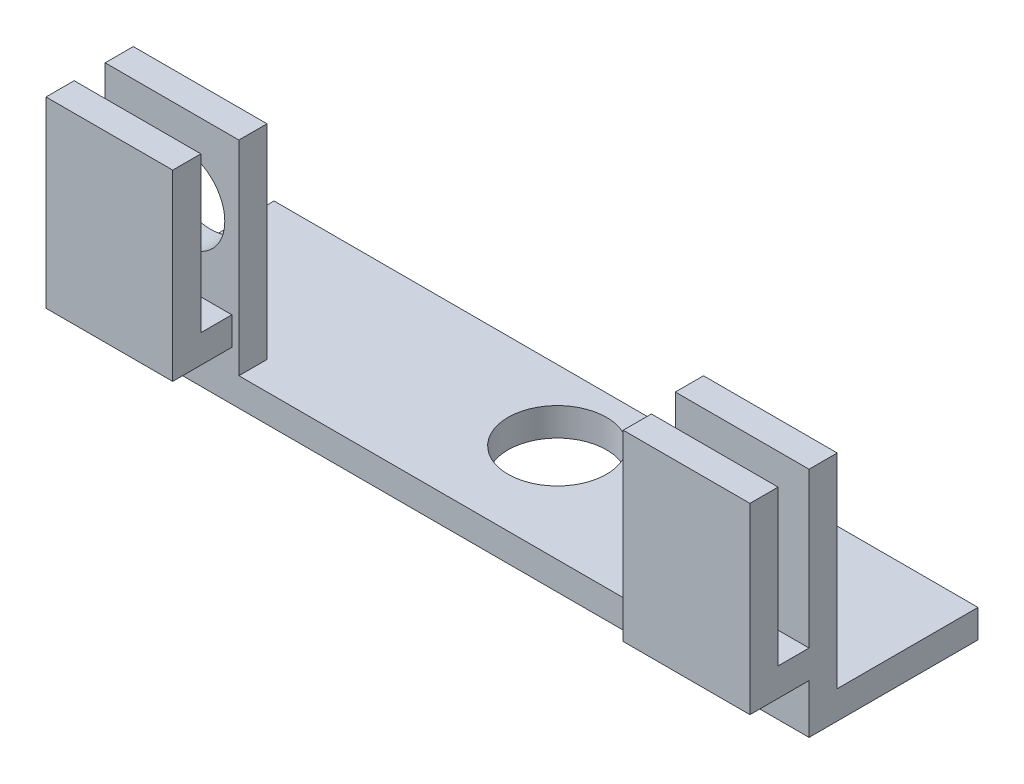
ISO-10303-21;
HEADER;
FILE_DESCRIPTION(('STEP AP214'),'2;1');
FILE_NAME('part.step','',(''),(''),'','','');
FILE_SCHEMA(('AUTOMOTIVE_DESIGN { 1 0 10303 214 1 1 1 1 }'));
ENDSEC;
DATA;
#1=APPLICATION_CONTEXT('core data for automotive mechanical design processes');
#2=APPLICATION_PROTOCOL_DEFINITION('international standard','automotive_design',2000,#1);
#3=PRODUCT_CONTEXT('',#1,'mechanical');
#4=PRODUCT('Part','Part','',(#3));
#5=PRODUCT_RELATED_PRODUCT_CATEGORY('part','',(#4));
#6=PRODUCT_DEFINITION_FORMATION('','',#4);
#7=PRODUCT_DEFINITION_CONTEXT('part definition',#1,'design');
#8=PRODUCT_DEFINITION('design','',#6,#7);
#9=PRODUCT_DEFINITION_SHAPE('','',#8);
#10=(LENGTH_UNIT() NAMED_UNIT(*) SI_UNIT(.MILLI.,.METRE.));
#11=(NAMED_UNIT(*) PLANE_ANGLE_UNIT() SI_UNIT($,.RADIAN.));
#12=(NAMED_UNIT(*) SI_UNIT($,.STERADIAN.) SOLID_ANGLE_UNIT());
#13=UNCERTAINTY_MEASURE_WITH_UNIT(LENGTH_MEASURE(1.E-05),#10,'distance_accuracy_value','');
#14=(GEOMETRIC_REPRESENTATION_CONTEXT(3) GLOBAL_UNCERTAINTY_ASSIGNED_CONTEXT((#13)) GLOBAL_UNIT_ASSIGNED_CONTEXT((#10,
#11,#12)) REPRESENTATION_CONTEXT('',''));
#15=CARTESIAN_POINT('',(0.,0.,0.));
#16=DIRECTION('',(0.,0.,1.));
#17=DIRECTION('',(1.,0.,0.));
#18=AXIS2_PLACEMENT_3D('',#15,#16,#17);
#19=CARTESIAN_POINT('',(0.,0.,1.));
#20=DIRECTION('',(0.,0.,1.));
#21=DIRECTION('',(1.,0.,0.));
#22=AXIS2_PLACEMENT_3D('',#19,#20,#21);
#23=PLANE('',#22);
#24=CARTESIAN_POINT('',(-0.18065955140499,2.83145936235665,1.));
#25=DIRECTION('',(0.,0.,1.));
#26=DIRECTION('',(1.,0.,0.));
#27=AXIS2_PLACEMENT_3D('',#24,#25,#26);
#28=CIRCLE('',#27,1.5);
#29=CARTESIAN_POINT('',(1.31934044859501,2.83145936235665,1.));
#30=VERTEX_POINT('',#29);
#31=EDGE_CURVE('E363',#30,#30,#28,.T.);
#32=ORIENTED_EDGE('',*,*,#31,.F.);
#33=EDGE_LOOP('',(#32));
#34=FACE_BOUND('',#33,.T.);
#35=CARTESIAN_POINT('',(19.319340448595,2.83145936235665,1.));
#36=DIRECTION('',(0.,0.,1.));
#37=DIRECTION('',(1.,0.,0.));
#38=AXIS2_PLACEMENT_3D('',#35,#36,#37);
#39=CIRCLE('',#38,1.5);
#40=CARTESIAN_POINT('',(20.819340448595,2.83145936235665,1.));
#41=VERTEX_POINT('',#40);
#42=EDGE_CURVE('E355',#41,#41,#39,.T.);
#43=ORIENTED_EDGE('',*,*,#42,.F.);
#44=EDGE_LOOP('',(#43));
#45=FACE_BOUND('',#44,.T.);
#46=DIRECTION('',(0.,-1.,0.));
#47=VECTOR('',#46,1.);
#48=CARTESIAN_POINT('',(17.569340448595,-0.918540637643355,1.));
#49=LINE('',#48,#47);
#50=CARTESIAN_POINT('',(17.569340448595,0.0814593623566466,1.));
#51=VERTEX_POINT('',#50);
#52=CARTESIAN_POINT('',(17.569340448595,-0.918540637643355,1.));
#53=VERTEX_POINT('',#52);
#54=EDGE_CURVE('E57',#51,#53,#49,.T.);
#55=ORIENTED_EDGE('',*,*,#54,.F.);
#56=DIRECTION('',(-1.,0.,0.));
#57=VECTOR('',#56,1.);
#58=CARTESIAN_POINT('',(22.069340448595,0.0814593623566472,1.));
#59=LINE('',#58,#57);
#60=CARTESIAN_POINT('',(22.069340448595,0.0814593623566472,1.));
#61=VERTEX_POINT('',#60);
#62=EDGE_CURVE('E271',#61,#51,#59,.T.);
#63=ORIENTED_EDGE('',*,*,#62,.F.);
#64=DIRECTION('',(0.,1.,0.));
#65=VECTOR('',#64,1.);
#66=CARTESIAN_POINT('',(22.069340448595,-2.66854063764335,1.));
#67=LINE('',#66,#65);
#68=CARTESIAN_POINT('',(22.069340448595,5.58145936235664,1.));
#69=VERTEX_POINT('',#68);
#70=EDGE_CURVE('E383',#61,#69,#67,.T.);
#71=ORIENTED_EDGE('',*,*,#70,.T.);
#72=DIRECTION('',(-1.,0.,0.));
#73=VECTOR('',#72,1.);
#74=CARTESIAN_POINT('',(22.069340448595,5.58145936235664,1.));
#75=LINE('',#74,#73);
#76=CARTESIAN_POINT('',(17.319340448595,5.58145936235664,1.));
#77=VERTEX_POINT('',#76);
#78=EDGE_CURVE('E387',#69,#77,#75,.T.);
#79=ORIENTED_EDGE('',*,*,#78,.T.);
#80=DIRECTION('',(0.,-1.,0.));
#81=VECTOR('',#80,1.);
#82=CARTESIAN_POINT('',(17.319340448595,5.58145936235664,1.));
#83=LINE('',#82,#81);
#84=CARTESIAN_POINT('',(17.319340448595,-1.66854063764336,1.));
#85=VERTEX_POINT('',#84);
#86=EDGE_CURVE('E390',#77,#85,#83,.T.);
#87=ORIENTED_EDGE('',*,*,#86,.T.);
#88=DIRECTION('',(-1.,0.,0.));
#89=VECTOR('',#88,1.);
#90=CARTESIAN_POINT('',(17.319340448595,-1.66854063764336,1.));
#91=LINE('',#90,#89);
#92=CARTESIAN_POINT('',(1.81934044859501,-1.66854063764336,1.));
#93=VERTEX_POINT('',#92);
#94=EDGE_CURVE('E393',#85,#93,#91,.T.);
#95=ORIENTED_EDGE('',*,*,#94,.T.);
#96=DIRECTION('',(0.,1.,0.));
#97=VECTOR('',#96,1.);
#98=CARTESIAN_POINT('',(1.81934044859501,-1.66854063764336,1.));
#99=LINE('',#98,#97);
#100=CARTESIAN_POINT('',(1.81934044859501,5.58145936235665,1.));
#101=VERTEX_POINT('',#100);
#102=EDGE_CURVE('E396',#93,#101,#99,.T.);
#103=ORIENTED_EDGE('',*,*,#102,.T.);
#104=DIRECTION('',(-1.,0.,0.));
#105=VECTOR('',#104,1.);
#106=CARTESIAN_POINT('',(1.81934044859501,5.58145936235665,1.));
#107=LINE('',#106,#105);
#108=CARTESIAN_POINT('',(-2.93065955140499,5.58145936235664,1.));
#109=VERTEX_POINT('',#108);
#110=EDGE_CURVE('E371',#101,#109,#107,.T.);
#111=ORIENTED_EDGE('',*,*,#110,.T.);
#112=DIRECTION('',(0.,-1.,0.));
#113=VECTOR('',#112,1.);
#114=CARTESIAN_POINT('',(-2.93065955140499,5.58145936235664,1.));
#115=LINE('',#114,#113);
#116=CARTESIAN_POINT('',(-2.93065955140499,0.0814593623566457,1.));
#117=VERTEX_POINT('',#116);
#118=EDGE_CURVE('E377',#109,#117,#115,.T.);
#119=ORIENTED_EDGE('',*,*,#118,.T.);
#120=DIRECTION('',(-1.,0.,0.));
#121=VECTOR('',#120,1.);
#122=CARTESIAN_POINT('',(1.56934044859501,0.0814593623566463,1.));
#123=LINE('',#122,#121);
#124=CARTESIAN_POINT('',(1.56934044859501,0.0814593623566463,1.));
#125=VERTEX_POINT('',#124);
#126=EDGE_CURVE('E300',#125,#117,#123,.T.);
#127=ORIENTED_EDGE('',*,*,#126,.F.);
#128=DIRECTION('',(0.,1.,0.));
#129=VECTOR('',#128,1.);
#130=CARTESIAN_POINT('',(1.56934044859501,-0.918540637643354,1.));
#131=LINE('',#130,#129);
#132=CARTESIAN_POINT('',(1.56934044859501,-0.918540637643354,1.));
#133=VERTEX_POINT('',#132);
#134=EDGE_CURVE('E290',#133,#125,#131,.T.);
#135=ORIENTED_EDGE('',*,*,#134,.F.);
#136=DIRECTION('',(1.,0.,0.));
#137=VECTOR('',#136,1.);
#138=CARTESIAN_POINT('',(-2.93065955140499,-0.918540637643354,1.));
#139=LINE('',#138,#137);
#140=CARTESIAN_POINT('',(-2.93065955140499,-0.918540637643355,1.));
#141=VERTEX_POINT('',#140);
#142=EDGE_CURVE('E296',#141,#133,#139,.T.);
#143=ORIENTED_EDGE('',*,*,#142,.F.);
#144=CARTESIAN_POINT('',(-2.93065955140499,-2.66854063764336,1.));
#145=VERTEX_POINT('',#144);
#146=EDGE_CURVE('E375',#141,#145,#115,.T.);
#147=ORIENTED_EDGE('',*,*,#146,.T.);
#148=DIRECTION('',(1.,0.,0.));
#149=VECTOR('',#148,1.);
#150=CARTESIAN_POINT('',(-2.93065955140499,-2.66854063764336,1.));
#151=LINE('',#150,#149);
#152=CARTESIAN_POINT('',(22.069340448595,-2.66854063764335,1.));
#153=VERTEX_POINT('',#152);
#154=EDGE_CURVE('E380',#145,#153,#151,.T.);
#155=ORIENTED_EDGE('',*,*,#154,.T.);
#156=CARTESIAN_POINT('',(22.069340448595,-0.918540637643355,1.));
#157=VERTEX_POINT('',#156);
#158=EDGE_CURVE('E384',#153,#157,#67,.T.);
#159=ORIENTED_EDGE('',*,*,#158,.T.);
#160=DIRECTION('',(1.,0.,0.));
#161=VECTOR('',#160,1.);
#162=CARTESIAN_POINT('',(22.069340448595,-0.918540637643354,1.));
#163=LINE('',#162,#161);
#164=EDGE_CURVE('E62',#53,#157,#163,.T.);
#165=ORIENTED_EDGE('',*,*,#164,.F.);
#166=EDGE_LOOP('',(#55,#63,#71,#79,#87,#95,#103,#111,#119,#127,#135,#143,#147,#155,#159,#165));
#167=FACE_BOUND('',#166,.T.);
#168=ADVANCED_FACE('F39',(#34,#45,#167),#23,.T.);
#169=CARTESIAN_POINT('',(0.,0.,0.));
#170=DIRECTION('',(0.,0.,1.));
#171=DIRECTION('',(1.,0.,0.));
#172=AXIS2_PLACEMENT_3D('',#169,#170,#171);
#173=PLANE('',#172);
#174=CARTESIAN_POINT('',(-0.18065955140499,2.83145936235665,0.));
#175=DIRECTION('',(0.,0.,1.));
#176=DIRECTION('',(1.,0.,0.));
#177=AXIS2_PLACEMENT_3D('',#174,#175,#176);
#178=CIRCLE('',#177,1.5);
#179=CARTESIAN_POINT('',(1.31934044859501,2.83145936235665,0.));
#180=VERTEX_POINT('',#179);
#181=EDGE_CURVE('E359',#180,#180,#178,.T.);
#182=ORIENTED_EDGE('',*,*,#181,.T.);
#183=EDGE_LOOP('',(#182));
#184=FACE_BOUND('',#183,.T.);
#185=DIRECTION('',(1.,0.,0.));
#186=VECTOR('',#185,1.);
#187=CARTESIAN_POINT('',(22.069340448595,-1.66854063764336,0.));
#188=LINE('',#187,#186);
#189=CARTESIAN_POINT('',(-2.93065955140499,-1.66854063764336,0.));
#190=VERTEX_POINT('',#189);
#191=CARTESIAN_POINT('',(1.81934044859501,-1.66854063764336,0.));
#192=VERTEX_POINT('',#191);
#193=EDGE_CURVE('E50',#190,#192,#188,.T.);
#194=ORIENTED_EDGE('',*,*,#193,.F.);
#195=DIRECTION('',(0.,-1.,0.));
#196=VECTOR('',#195,1.);
#197=CARTESIAN_POINT('',(-2.93065955140499,5.58145936235664,0.));
#198=LINE('',#197,#196);
#199=CARTESIAN_POINT('',(-2.93065955140499,5.58145936235664,0.));
#200=VERTEX_POINT('',#199);
#201=EDGE_CURVE('E403',#200,#190,#198,.T.);
#202=ORIENTED_EDGE('',*,*,#201,.F.);
#203=DIRECTION('',(-1.,0.,0.));
#204=VECTOR('',#203,1.);
#205=CARTESIAN_POINT('',(1.81934044859501,5.58145936235665,0.));
#206=LINE('',#205,#204);
#207=CARTESIAN_POINT('',(1.81934044859501,5.58145936235665,0.));
#208=VERTEX_POINT('',#207);
#209=EDGE_CURVE('E367',#208,#200,#206,.T.);
#210=ORIENTED_EDGE('',*,*,#209,.F.);
#211=DIRECTION('',(0.,1.,0.));
#212=VECTOR('',#211,1.);
#213=CARTESIAN_POINT('',(1.81934044859501,-1.66854063764336,0.));
#214=LINE('',#213,#212);
#215=EDGE_CURVE('E376',#192,#208,#214,.T.);
#216=ORIENTED_EDGE('',*,*,#215,.F.);
#217=EDGE_LOOP('',(#194,#202,#210,#216));
#218=FACE_BOUND('',#217,.T.);
#219=ADVANCED_FACE('F457',(#184,#218),#173,.F.);
#220=CARTESIAN_POINT('',(19.319340448595,2.83145936235665,0.));
#221=DIRECTION('',(0.,0.,1.));
#222=DIRECTION('',(1.,0.,0.));
#223=AXIS2_PLACEMENT_3D('',#220,#221,#222);
#224=CIRCLE('',#223,1.5);
#225=CARTESIAN_POINT('',(20.819340448595,2.83145936235665,0.));
#226=VERTEX_POINT('',#225);
#227=EDGE_CURVE('E354',#226,#226,#224,.T.);
#228=ORIENTED_EDGE('',*,*,#227,.T.);
#229=EDGE_LOOP('',(#228));
#230=FACE_BOUND('',#229,.T.);
#231=CARTESIAN_POINT('',(17.319340448595,-1.66854063764336,0.));
#232=VERTEX_POINT('',#231);
#233=CARTESIAN_POINT('',(22.069340448595,-1.66854063764336,0.));
#234=VERTEX_POINT('',#233);
#235=EDGE_CURVE('E11',#232,#234,#188,.T.);
#236=ORIENTED_EDGE('',*,*,#235,.F.);
#237=DIRECTION('',(0.,-1.,0.));
#238=VECTOR('',#237,1.);
#239=CARTESIAN_POINT('',(17.319340448595,5.58145936235664,0.));
#240=LINE('',#239,#238);
#241=CARTESIAN_POINT('',(17.319340448595,5.58145936235664,0.));
#242=VERTEX_POINT('',#241);
#243=EDGE_CURVE('E413',#242,#232,#240,.T.);
#244=ORIENTED_EDGE('',*,*,#243,.F.);
#245=DIRECTION('',(-1.,0.,0.));
#246=VECTOR('',#245,1.);
#247=CARTESIAN_POINT('',(22.069340448595,5.58145936235664,0.));
#248=LINE('',#247,#246);
#249=CARTESIAN_POINT('',(22.069340448595,5.58145936235664,0.));
#250=VERTEX_POINT('',#249);
#251=EDGE_CURVE('E410',#250,#242,#248,.T.);
#252=ORIENTED_EDGE('',*,*,#251,.F.);
#253=DIRECTION('',(0.,1.,0.));
#254=VECTOR('',#253,1.);
#255=CARTESIAN_POINT('',(22.069340448595,-2.66854063764335,0.));
#256=LINE('',#255,#254);
#257=EDGE_CURVE('E407',#234,#250,#256,.T.);
#258=ORIENTED_EDGE('',*,*,#257,.F.);
#259=EDGE_LOOP('',(#236,#244,#252,#258));
#260=FACE_BOUND('',#259,.T.);
#261=ADVANCED_FACE('F490',(#230,#260),#173,.F.);
#262=CARTESIAN_POINT('',(1.81934044859501,5.58145936235665,1.));
#263=DIRECTION('',(0.,-1.,0.));
#264=DIRECTION('',(1.,0.,0.));
#265=AXIS2_PLACEMENT_3D('',#262,#263,#264);
#266=PLANE('',#265);
#267=ORIENTED_EDGE('',*,*,#209,.T.);
#268=DIRECTION('',(0.,0.,-1.));
#269=VECTOR('',#268,1.);
#270=CARTESIAN_POINT('',(-2.93065955140499,5.58145936235664,1.));
#271=LINE('',#270,#269);
#272=EDGE_CURVE('E43',#109,#200,#271,.T.);
#273=ORIENTED_EDGE('',*,*,#272,.F.);
#274=ORIENTED_EDGE('',*,*,#110,.F.);
#275=DIRECTION('',(0.,0.,-1.));
#276=VECTOR('',#275,1.);
#277=CARTESIAN_POINT('',(1.81934044859501,5.58145936235665,1.));
#278=LINE('',#277,#276);
#279=EDGE_CURVE('E399',#101,#208,#278,.T.);
#280=ORIENTED_EDGE('',*,*,#279,.T.);
#281=EDGE_LOOP('',(#267,#273,#274,#280));
#282=FACE_BOUND('',#281,.T.);
#283=ADVANCED_FACE('F41',(#282),#266,.F.);
#284=CARTESIAN_POINT('',(-2.93065955140499,5.58145936235664,1.));
#285=DIRECTION('',(1.,0.,0.));
#286=DIRECTION('',(0.,1.,0.));
#287=AXIS2_PLACEMENT_3D('',#284,#285,#286);
#288=PLANE('',#287);
#289=ORIENTED_EDGE('',*,*,#201,.T.);
#290=DIRECTION('',(0.,0.,1.));
#291=VECTOR('',#290,1.);
#292=CARTESIAN_POINT('',(-2.93065955140499,-1.66854063764336,-5.));
#293=LINE('',#292,#291);
#294=CARTESIAN_POINT('',(-2.93065955140499,-1.66854063764336,-5.));
#295=VERTEX_POINT('',#294);
#296=EDGE_CURVE('E350',#295,#190,#293,.T.);
#297=ORIENTED_EDGE('',*,*,#296,.F.);
#298=DIRECTION('',(0.,1.,0.));
#299=VECTOR('',#298,1.);
#300=CARTESIAN_POINT('',(-2.93065955140499,-2.66854063764335,-5.));
#301=LINE('',#300,#299);
#302=CARTESIAN_POINT('',(-2.93065955140499,-2.66854063764335,-5.));
#303=VERTEX_POINT('',#302);
#304=EDGE_CURVE('E338',#303,#295,#301,.T.);
#305=ORIENTED_EDGE('',*,*,#304,.F.);
#306=DIRECTION('',(0.,0.,-1.));
#307=VECTOR('',#306,1.);
#308=CARTESIAN_POINT('',(-2.93065955140499,-2.66854063764336,1.));
#309=LINE('',#308,#307);
#310=EDGE_CURVE('E439',#145,#303,#309,.T.);
#311=ORIENTED_EDGE('',*,*,#310,.F.);
#312=ORIENTED_EDGE('',*,*,#146,.F.);
#313=DIRECTION('',(0.,0.,-1.));
#314=VECTOR('',#313,1.);
#315=CARTESIAN_POINT('',(-2.93065955140499,-0.918540637643354,2.1));
#316=LINE('',#315,#314);
#317=CARTESIAN_POINT('',(-2.93065955140499,-0.918540637643355,3.1));
#318=VERTEX_POINT('',#317);
#319=EDGE_CURVE('E310',#318,#141,#316,.T.);
#320=ORIENTED_EDGE('',*,*,#319,.F.);
#321=DIRECTION('',(0.,-1.,0.));
#322=VECTOR('',#321,1.);
#323=CARTESIAN_POINT('',(-2.93065955140499,-0.918540637643355,3.1));
#324=LINE('',#323,#322);
#325=CARTESIAN_POINT('',(-2.93065955140499,5.58145936235665,3.1));
#326=VERTEX_POINT('',#325);
#327=EDGE_CURVE('E240',#326,#318,#324,.T.);
#328=ORIENTED_EDGE('',*,*,#327,.F.);
#329=DIRECTION('',(0.,0.,-1.));
#330=VECTOR('',#329,1.);
#331=CARTESIAN_POINT('',(-2.93065955140499,5.58145936235665,3.1));
#332=LINE('',#331,#330);
#333=CARTESIAN_POINT('',(-2.93065955140499,5.58145936235665,2.1));
#334=VERTEX_POINT('',#333);
#335=EDGE_CURVE('E255',#326,#334,#332,.T.);
#336=ORIENTED_EDGE('',*,*,#335,.T.);
#337=DIRECTION('',(0.,-1.,0.));
#338=VECTOR('',#337,1.);
#339=CARTESIAN_POINT('',(-2.93065955140499,-0.918540637643355,2.1));
#340=LINE('',#339,#338);
#341=CARTESIAN_POINT('',(-2.93065955140499,0.0814593623566461,2.1));
#342=VERTEX_POINT('',#341);
#343=EDGE_CURVE('E239',#334,#342,#340,.T.);
#344=ORIENTED_EDGE('',*,*,#343,.T.);
#345=DIRECTION('',(0.,0.,-1.));
#346=VECTOR('',#345,1.);
#347=CARTESIAN_POINT('',(-2.93065955140499,0.0814593623566457,2.1));
#348=LINE('',#347,#346);
#349=EDGE_CURVE('E314',#342,#117,#348,.T.);
#350=ORIENTED_EDGE('',*,*,#349,.T.);
#351=ORIENTED_EDGE('',*,*,#118,.F.);
#352=ORIENTED_EDGE('',*,*,#272,.T.);
#353=EDGE_LOOP('',(#289,#297,#305,#311,#312,#320,#328,#336,#344,#350,#351,#352));
#354=FACE_BOUND('',#353,.T.);
#355=ADVANCED_FACE('F449',(#354),#288,.F.);
#356=CARTESIAN_POINT('',(-2.93065955140499,-2.66854063764336,1.));
#357=DIRECTION('',(0.,1.,0.));
#358=DIRECTION('',(-1.,0.,0.));
#359=AXIS2_PLACEMENT_3D('',#356,#357,#358);
#360=PLANE('',#359);
#361=CARTESIAN_POINT('',(9.62794513319409,-2.66854063764336,-2.5));
#362=DIRECTION('',(0.,1.,0.));
#363=DIRECTION('',(-1.,0.,0.));
#364=AXIS2_PLACEMENT_3D('',#361,#362,#363);
#365=CIRCLE('',#364,1.75);
#366=CARTESIAN_POINT('',(7.87794513319409,-2.66854063764336,-2.5));
#367=VERTEX_POINT('',#366);
#368=EDGE_CURVE('E326',#367,#367,#365,.T.);
#369=ORIENTED_EDGE('',*,*,#368,.T.);
#370=EDGE_LOOP('',(#369));
#371=FACE_BOUND('',#370,.T.);
#372=ORIENTED_EDGE('',*,*,#310,.T.);
#373=DIRECTION('',(-1.,0.,0.));
#374=VECTOR('',#373,1.);
#375=CARTESIAN_POINT('',(22.069340448595,-2.66854063764335,-5.));
#376=LINE('',#375,#374);
#377=CARTESIAN_POINT('',(22.069340448595,-2.66854063764335,-5.));
#378=VERTEX_POINT('',#377);
#379=EDGE_CURVE('E334',#378,#303,#376,.T.);
#380=ORIENTED_EDGE('',*,*,#379,.F.);
#381=DIRECTION('',(0.,0.,-1.));
#382=VECTOR('',#381,1.);
#383=CARTESIAN_POINT('',(22.069340448595,-2.66854063764335,1.));
#384=LINE('',#383,#382);
#385=EDGE_CURVE('E437',#153,#378,#384,.T.);
#386=ORIENTED_EDGE('',*,*,#385,.F.);
#387=ORIENTED_EDGE('',*,*,#154,.F.);
#388=EDGE_LOOP('',(#372,#380,#386,#387));
#389=FACE_BOUND('',#388,.T.);
#390=ADVANCED_FACE('F471',(#371,#389),#360,.F.);
#391=CARTESIAN_POINT('',(22.069340448595,-2.66854063764335,1.));
#392=DIRECTION('',(-1.,0.,0.));
#393=DIRECTION('',(0.,0.,1.));
#394=AXIS2_PLACEMENT_3D('',#391,#392,#393);
#395=PLANE('',#394);
#396=ORIENTED_EDGE('',*,*,#385,.T.);
#397=DIRECTION('',(0.,-1.,0.));
#398=VECTOR('',#397,1.);
#399=CARTESIAN_POINT('',(22.069340448595,-2.66854063764335,-5.));
#400=LINE('',#399,#398);
#401=CARTESIAN_POINT('',(22.069340448595,-1.66854063764336,-5.));
#402=VERTEX_POINT('',#401);
#403=EDGE_CURVE('E330',#402,#378,#400,.T.);
#404=ORIENTED_EDGE('',*,*,#403,.F.);
#405=DIRECTION('',(0.,0.,1.));
#406=VECTOR('',#405,1.);
#407=CARTESIAN_POINT('',(22.069340448595,-1.66854063764336,-5.));
#408=LINE('',#407,#406);
#409=EDGE_CURVE('E343',#402,#234,#408,.T.);
#410=ORIENTED_EDGE('',*,*,#409,.T.);
#411=ORIENTED_EDGE('',*,*,#257,.T.);
#412=DIRECTION('',(0.,0.,-1.));
#413=VECTOR('',#412,1.);
#414=CARTESIAN_POINT('',(22.069340448595,5.58145936235664,1.));
#415=LINE('',#414,#413);
#416=EDGE_CURVE('E433',#69,#250,#415,.T.);
#417=ORIENTED_EDGE('',*,*,#416,.F.);
#418=ORIENTED_EDGE('',*,*,#70,.F.);
#419=DIRECTION('',(0.,0.,-1.));
#420=VECTOR('',#419,1.);
#421=CARTESIAN_POINT('',(22.069340448595,0.0814593623566472,2.1));
#422=LINE('',#421,#420);
#423=CARTESIAN_POINT('',(22.069340448595,0.0814593623566472,2.1));
#424=VERTEX_POINT('',#423);
#425=EDGE_CURVE('E286',#424,#61,#422,.T.);
#426=ORIENTED_EDGE('',*,*,#425,.F.);
#427=DIRECTION('',(0.,1.,0.));
#428=VECTOR('',#427,1.);
#429=CARTESIAN_POINT('',(22.069340448595,-0.918540637643354,2.1));
#430=LINE('',#429,#428);
#431=CARTESIAN_POINT('',(22.069340448595,5.58145936235664,2.1));
#432=VERTEX_POINT('',#431);
#433=EDGE_CURVE('E219',#424,#432,#430,.T.);
#434=ORIENTED_EDGE('',*,*,#433,.T.);
#435=DIRECTION('',(0.,0.,-1.));
#436=VECTOR('',#435,1.);
#437=CARTESIAN_POINT('',(22.069340448595,5.58145936235664,3.1));
#438=LINE('',#437,#436);
#439=CARTESIAN_POINT('',(22.069340448595,5.58145936235664,3.1));
#440=VERTEX_POINT('',#439);
#441=EDGE_CURVE('E235',#440,#432,#438,.T.);
#442=ORIENTED_EDGE('',*,*,#441,.F.);
#443=DIRECTION('',(0.,1.,0.));
#444=VECTOR('',#443,1.);
#445=CARTESIAN_POINT('',(22.069340448595,-0.918540637643354,3.1));
#446=LINE('',#445,#444);
#447=CARTESIAN_POINT('',(22.069340448595,-0.918540637643354,3.1));
#448=VERTEX_POINT('',#447);
#449=EDGE_CURVE('E209',#448,#440,#446,.T.);
#450=ORIENTED_EDGE('',*,*,#449,.F.);
#451=DIRECTION('',(0.,0.,-1.));
#452=VECTOR('',#451,1.);
#453=CARTESIAN_POINT('',(22.069340448595,-0.918540637643354,2.1));
#454=LINE('',#453,#452);
#455=EDGE_CURVE('E200',#448,#157,#454,.T.);
#456=ORIENTED_EDGE('',*,*,#455,.T.);
#457=ORIENTED_EDGE('',*,*,#158,.F.);
#458=EDGE_LOOP('',(#396,#404,#410,#411,#417,#418,#426,#434,#442,#450,#456,#457));
#459=FACE_BOUND('',#458,.T.);
#460=ADVANCED_FACE('F474',(#459),#395,.F.);
#461=CARTESIAN_POINT('',(22.069340448595,5.58145936235664,1.));
#462=DIRECTION('',(0.,-1.,0.));
#463=DIRECTION('',(1.,0.,0.));
#464=AXIS2_PLACEMENT_3D('',#461,#462,#463);
#465=PLANE('',#464);
#466=ORIENTED_EDGE('',*,*,#251,.T.);
#467=DIRECTION('',(0.,0.,-1.));
#468=VECTOR('',#467,1.);
#469=CARTESIAN_POINT('',(17.319340448595,5.58145936235664,1.));
#470=LINE('',#469,#468);
#471=EDGE_CURVE('E429',#77,#242,#470,.T.);
#472=ORIENTED_EDGE('',*,*,#471,.F.);
#473=ORIENTED_EDGE('',*,*,#78,.F.);
#474=ORIENTED_EDGE('',*,*,#416,.T.);
#475=EDGE_LOOP('',(#466,#472,#473,#474));
#476=FACE_BOUND('',#475,.T.);
#477=ADVANCED_FACE('F483',(#476),#465,.F.);
#478=CARTESIAN_POINT('',(17.319340448595,5.58145936235664,1.));
#479=DIRECTION('',(1.,0.,0.));
#480=DIRECTION('',(0.,0.,-1.));
#481=AXIS2_PLACEMENT_3D('',#478,#479,#480);
#482=PLANE('',#481);
#483=ORIENTED_EDGE('',*,*,#243,.T.);
#484=DIRECTION('',(0.,0.,-1.));
#485=VECTOR('',#484,1.);
#486=CARTESIAN_POINT('',(17.319340448595,-1.66854063764336,1.));
#487=LINE('',#486,#485);
#488=EDGE_CURVE('E425',#85,#232,#487,.T.);
#489=ORIENTED_EDGE('',*,*,#488,.F.);
#490=ORIENTED_EDGE('',*,*,#86,.F.);
#491=ORIENTED_EDGE('',*,*,#471,.T.);
#492=EDGE_LOOP('',(#483,#489,#490,#491));
#493=FACE_BOUND('',#492,.T.);
#494=ADVANCED_FACE('F488',(#493),#482,.F.);
#495=CARTESIAN_POINT('',(17.319340448595,-1.66854063764336,1.));
#496=DIRECTION('',(0.,-1.,0.));
#497=DIRECTION('',(1.,0.,0.));
#498=AXIS2_PLACEMENT_3D('',#495,#496,#497);
#499=PLANE('',#498);
#500=CARTESIAN_POINT('',(9.62794513319409,-1.66854063764336,-2.5));
#501=DIRECTION('',(0.,1.,0.));
#502=DIRECTION('',(-1.,0.,0.));
#503=AXIS2_PLACEMENT_3D('',#500,#501,#502);
#504=CIRCLE('',#503,1.75);
#505=CARTESIAN_POINT('',(7.87794513319409,-1.66854063764336,-2.5));
#506=VERTEX_POINT('',#505);
#507=EDGE_CURVE('E322',#506,#506,#504,.T.);
#508=ORIENTED_EDGE('',*,*,#507,.F.);
#509=EDGE_LOOP('',(#508));
#510=FACE_BOUND('',#509,.T.);
#511=ORIENTED_EDGE('',*,*,#488,.T.);
#512=ORIENTED_EDGE('',*,*,#235,.T.);
#513=ORIENTED_EDGE('',*,*,#409,.F.);
#514=DIRECTION('',(1.,0.,0.));
#515=VECTOR('',#514,1.);
#516=CARTESIAN_POINT('',(22.069340448595,-1.66854063764336,-5.));
#517=LINE('',#516,#515);
#518=EDGE_CURVE('E341',#295,#402,#517,.T.);
#519=ORIENTED_EDGE('',*,*,#518,.F.);
#520=ORIENTED_EDGE('',*,*,#296,.T.);
#521=ORIENTED_EDGE('',*,*,#193,.T.);
#522=DIRECTION('',(0.,0.,-1.));
#523=VECTOR('',#522,1.);
#524=CARTESIAN_POINT('',(1.81934044859501,-1.66854063764336,1.));
#525=LINE('',#524,#523);
#526=EDGE_CURVE('E422',#93,#192,#525,.T.);
#527=ORIENTED_EDGE('',*,*,#526,.F.);
#528=ORIENTED_EDGE('',*,*,#94,.F.);
#529=EDGE_LOOP('',(#511,#512,#513,#519,#520,#521,#527,#528));
#530=FACE_BOUND('',#529,.T.);
#531=ADVANCED_FACE('F460',(#510,#530),#499,.F.);
#532=CARTESIAN_POINT('',(1.81934044859501,-1.66854063764336,1.));
#533=DIRECTION('',(-1.,0.,0.));
#534=DIRECTION('',(0.,-1.,0.));
#535=AXIS2_PLACEMENT_3D('',#532,#533,#534);
#536=PLANE('',#535);
#537=ORIENTED_EDGE('',*,*,#215,.T.);
#538=ORIENTED_EDGE('',*,*,#279,.F.);
#539=ORIENTED_EDGE('',*,*,#102,.F.);
#540=ORIENTED_EDGE('',*,*,#526,.T.);
#541=EDGE_LOOP('',(#537,#538,#539,#540));
#542=FACE_BOUND('',#541,.T.);
#543=ADVANCED_FACE('F512',(#542),#536,.F.);
#544=CARTESIAN_POINT('',(-0.18065955140499,2.83145936235665,1.));
#545=DIRECTION('',(0.,0.,-1.));
#546=DIRECTION('',(-1.,0.,0.));
#547=AXIS2_PLACEMENT_3D('',#544,#545,#546);
#548=CYLINDRICAL_SURFACE('',#547,1.5);
#549=ORIENTED_EDGE('',*,*,#31,.T.);
#550=EDGE_LOOP('',(#549));
#551=FACE_BOUND('',#550,.T.);
#552=ORIENTED_EDGE('',*,*,#181,.F.);
#553=EDGE_LOOP('',(#552));
#554=FACE_BOUND('',#553,.T.);
#555=ADVANCED_FACE('F508',(#551,#554),#548,.F.);
#556=CARTESIAN_POINT('',(19.319340448595,2.83145936235665,1.));
#557=DIRECTION('',(0.,0.,-1.));
#558=DIRECTION('',(-1.,0.,0.));
#559=AXIS2_PLACEMENT_3D('',#556,#557,#558);
#560=CYLINDRICAL_SURFACE('',#559,1.5);
#561=ORIENTED_EDGE('',*,*,#42,.T.);
#562=EDGE_LOOP('',(#561));
#563=FACE_BOUND('',#562,.T.);
#564=ORIENTED_EDGE('',*,*,#227,.F.);
#565=EDGE_LOOP('',(#564));
#566=FACE_BOUND('',#565,.T.);
#567=ADVANCED_FACE('F511',(#563,#566),#560,.F.);
#568=CARTESIAN_POINT('',(0.,0.,-5.));
#569=DIRECTION('',(0.,0.,1.));
#570=DIRECTION('',(1.,0.,0.));
#571=AXIS2_PLACEMENT_3D('',#568,#569,#570);
#572=PLANE('',#571);
#573=ORIENTED_EDGE('',*,*,#403,.T.);
#574=ORIENTED_EDGE('',*,*,#379,.T.);
#575=ORIENTED_EDGE('',*,*,#304,.T.);
#576=ORIENTED_EDGE('',*,*,#518,.T.);
#577=EDGE_LOOP('',(#573,#574,#575,#576));
#578=FACE_BOUND('',#577,.T.);
#579=ADVANCED_FACE('F468',(#578),#572,.F.);
#580=CARTESIAN_POINT('',(9.62794513319409,-6.66854063764336,-2.5));
#581=DIRECTION('',(0.,1.,0.));
#582=DIRECTION('',(-1.,0.,0.));
#583=AXIS2_PLACEMENT_3D('',#580,#581,#582);
#584=CYLINDRICAL_SURFACE('',#583,1.75);
#585=ORIENTED_EDGE('',*,*,#507,.T.);
#586=EDGE_LOOP('',(#585));
#587=FACE_BOUND('',#586,.T.);
#588=ORIENTED_EDGE('',*,*,#368,.F.);
#589=EDGE_LOOP('',(#588));
#590=FACE_BOUND('',#589,.T.);
#591=ADVANCED_FACE('F519',(#587,#590),#584,.F.);
#592=CARTESIAN_POINT('',(1.56934044859501,-0.918540637643354,2.1));
#593=DIRECTION('',(-1.,0.,0.));
#594=DIRECTION('',(0.,-1.,0.));
#595=AXIS2_PLACEMENT_3D('',#592,#593,#594);
#596=PLANE('',#595);
#597=ORIENTED_EDGE('',*,*,#134,.T.);
#598=DIRECTION('',(0.,0.,-1.));
#599=VECTOR('',#598,1.);
#600=CARTESIAN_POINT('',(1.56934044859501,0.0814593623566463,2.1));
#601=LINE('',#600,#599);
#602=CARTESIAN_POINT('',(1.56934044859501,0.0814593623566463,2.1));
#603=VERTEX_POINT('',#602);
#604=EDGE_CURVE('E318',#603,#125,#601,.T.);
#605=ORIENTED_EDGE('',*,*,#604,.F.);
#606=DIRECTION('',(0.,1.,0.));
#607=VECTOR('',#606,1.);
#608=CARTESIAN_POINT('',(1.56934044859501,-0.918540637643355,2.1));
#609=LINE('',#608,#607);
#610=CARTESIAN_POINT('',(1.56934044859501,5.58145936235665,2.1));
#611=VERTEX_POINT('',#610);
#612=EDGE_CURVE('E259',#603,#611,#609,.T.);
#613=ORIENTED_EDGE('',*,*,#612,.T.);
#614=DIRECTION('',(0.,0.,-1.));
#615=VECTOR('',#614,1.);
#616=CARTESIAN_POINT('',(1.56934044859501,5.58145936235665,3.1));
#617=LINE('',#616,#615);
#618=CARTESIAN_POINT('',(1.56934044859501,5.58145936235665,3.1));
#619=VERTEX_POINT('',#618);
#620=EDGE_CURVE('E267',#619,#611,#617,.T.);
#621=ORIENTED_EDGE('',*,*,#620,.F.);
#622=DIRECTION('',(0.,1.,0.));
#623=VECTOR('',#622,1.);
#624=CARTESIAN_POINT('',(1.56934044859501,-0.918540637643355,3.1));
#625=LINE('',#624,#623);
#626=CARTESIAN_POINT('',(1.56934044859501,-0.918540637643355,3.1));
#627=VERTEX_POINT('',#626);
#628=EDGE_CURVE('E249',#627,#619,#625,.T.);
#629=ORIENTED_EDGE('',*,*,#628,.F.);
#630=DIRECTION('',(0.,0.,-1.));
#631=VECTOR('',#630,1.);
#632=CARTESIAN_POINT('',(1.56934044859501,-0.918540637643354,2.1));
#633=LINE('',#632,#631);
#634=EDGE_CURVE('E295',#627,#133,#633,.T.);
#635=ORIENTED_EDGE('',*,*,#634,.T.);
#636=EDGE_LOOP('',(#597,#605,#613,#621,#629,#635));
#637=FACE_BOUND('',#636,.T.);
#638=ADVANCED_FACE('F522',(#637),#596,.F.);
#639=CARTESIAN_POINT('',(1.56934044859501,0.0814593623566463,2.1));
#640=DIRECTION('',(0.,-1.,0.));
#641=DIRECTION('',(1.,0.,0.));
#642=AXIS2_PLACEMENT_3D('',#639,#640,#641);
#643=PLANE('',#642);
#644=ORIENTED_EDGE('',*,*,#126,.T.);
#645=ORIENTED_EDGE('',*,*,#349,.F.);
#646=DIRECTION('',(-1.,0.,0.));
#647=VECTOR('',#646,1.);
#648=CARTESIAN_POINT('',(1.56934044859501,0.0814593623566463,2.1));
#649=LINE('',#648,#647);
#650=EDGE_CURVE('E291',#603,#342,#649,.T.);
#651=ORIENTED_EDGE('',*,*,#650,.F.);
#652=ORIENTED_EDGE('',*,*,#604,.T.);
#653=EDGE_LOOP('',(#644,#645,#651,#652));
#654=FACE_BOUND('',#653,.T.);
#655=ADVANCED_FACE('F526',(#654),#643,.F.);
#656=CARTESIAN_POINT('',(-2.93065955140499,-0.918540637643354,2.1));
#657=DIRECTION('',(0.,1.,0.));
#658=DIRECTION('',(0.,0.,1.));
#659=AXIS2_PLACEMENT_3D('',#656,#657,#658);
#660=PLANE('',#659);
#661=ORIENTED_EDGE('',*,*,#142,.T.);
#662=ORIENTED_EDGE('',*,*,#634,.F.);
#663=DIRECTION('',(1.,0.,0.));
#664=VECTOR('',#663,1.);
#665=CARTESIAN_POINT('',(-2.93065955140499,-0.918540637643355,3.1));
#666=LINE('',#665,#664);
#667=EDGE_CURVE('E244',#318,#627,#666,.T.);
#668=ORIENTED_EDGE('',*,*,#667,.F.);
#669=ORIENTED_EDGE('',*,*,#319,.T.);
#670=EDGE_LOOP('',(#661,#662,#668,#669));
#671=FACE_BOUND('',#670,.T.);
#672=ADVANCED_FACE('F530',(#671),#660,.F.);
#673=CARTESIAN_POINT('',(22.069340448595,0.0814593623566472,2.1));
#674=DIRECTION('',(0.,-1.,0.));
#675=DIRECTION('',(1.,0.,0.));
#676=AXIS2_PLACEMENT_3D('',#673,#674,#675);
#677=PLANE('',#676);
#678=ORIENTED_EDGE('',*,*,#62,.T.);
#679=DIRECTION('',(0.,0.,-1.));
#680=VECTOR('',#679,1.);
#681=CARTESIAN_POINT('',(17.569340448595,0.0814593623566466,2.1));
#682=LINE('',#681,#680);
#683=CARTESIAN_POINT('',(17.569340448595,0.0814593623566469,2.1));
#684=VERTEX_POINT('',#683);
#685=EDGE_CURVE('E199',#684,#51,#682,.T.);
#686=ORIENTED_EDGE('',*,*,#685,.F.);
#687=DIRECTION('',(-1.,0.,0.));
#688=VECTOR('',#687,1.);
#689=CARTESIAN_POINT('',(22.069340448595,0.0814593623566472,2.1));
#690=LINE('',#689,#688);
#691=EDGE_CURVE('E272',#424,#684,#690,.T.);
#692=ORIENTED_EDGE('',*,*,#691,.F.);
#693=ORIENTED_EDGE('',*,*,#425,.T.);
#694=EDGE_LOOP('',(#678,#686,#692,#693));
#695=FACE_BOUND('',#694,.T.);
#696=ADVANCED_FACE('F534',(#695),#677,.F.);
#697=CARTESIAN_POINT('',(17.569340448595,-0.918540637643355,2.1));
#698=DIRECTION('',(1.,0.,0.));
#699=DIRECTION('',(0.,0.,-1.));
#700=AXIS2_PLACEMENT_3D('',#697,#698,#699);
#701=PLANE('',#700);
#702=ORIENTED_EDGE('',*,*,#54,.T.);
#703=DIRECTION('',(0.,0.,-1.));
#704=VECTOR('',#703,1.);
#705=CARTESIAN_POINT('',(17.569340448595,-0.918540637643355,2.1));
#706=LINE('',#705,#704);
#707=CARTESIAN_POINT('',(17.569340448595,-0.918540637643354,3.1));
#708=VERTEX_POINT('',#707);
#709=EDGE_CURVE('E190',#708,#53,#706,.T.);
#710=ORIENTED_EDGE('',*,*,#709,.F.);
#711=DIRECTION('',(0.,-1.,0.));
#712=VECTOR('',#711,1.);
#713=CARTESIAN_POINT('',(17.569340448595,-0.918540637643354,3.1));
#714=LINE('',#713,#712);
#715=CARTESIAN_POINT('',(17.569340448595,5.58145936235664,3.1));
#716=VERTEX_POINT('',#715);
#717=EDGE_CURVE('E195',#716,#708,#714,.T.);
#718=ORIENTED_EDGE('',*,*,#717,.F.);
#719=DIRECTION('',(0.,0.,-1.));
#720=VECTOR('',#719,1.);
#721=CARTESIAN_POINT('',(17.569340448595,5.58145936235664,3.1));
#722=LINE('',#721,#720);
#723=CARTESIAN_POINT('',(17.569340448595,5.58145936235664,2.1));
#724=VERTEX_POINT('',#723);
#725=EDGE_CURVE('E226',#716,#724,#722,.T.);
#726=ORIENTED_EDGE('',*,*,#725,.T.);
#727=DIRECTION('',(0.,-1.,0.));
#728=VECTOR('',#727,1.);
#729=CARTESIAN_POINT('',(17.569340448595,-0.918540637643354,2.1));
#730=LINE('',#729,#728);
#731=EDGE_CURVE('E227',#724,#684,#730,.T.);
#732=ORIENTED_EDGE('',*,*,#731,.T.);
#733=ORIENTED_EDGE('',*,*,#685,.T.);
#734=EDGE_LOOP('',(#702,#710,#718,#726,#732,#733));
#735=FACE_BOUND('',#734,.T.);
#736=ADVANCED_FACE('F192',(#735),#701,.F.);
#737=CARTESIAN_POINT('',(22.069340448595,-0.918540637643354,2.1));
#738=DIRECTION('',(0.,1.,0.));
#739=DIRECTION('',(-1.,0.,0.));
#740=AXIS2_PLACEMENT_3D('',#737,#738,#739);
#741=PLANE('',#740);
#742=ORIENTED_EDGE('',*,*,#164,.T.);
#743=ORIENTED_EDGE('',*,*,#455,.F.);
#744=DIRECTION('',(1.,0.,0.));
#745=VECTOR('',#744,1.);
#746=CARTESIAN_POINT('',(17.569340448595,-0.918540637643354,3.1));
#747=LINE('',#746,#745);
#748=EDGE_CURVE('E203',#708,#448,#747,.T.);
#749=ORIENTED_EDGE('',*,*,#748,.F.);
#750=ORIENTED_EDGE('',*,*,#709,.T.);
#751=EDGE_LOOP('',(#742,#743,#749,#750));
#752=FACE_BOUND('',#751,.T.);
#753=ADVANCED_FACE('F204',(#752),#741,.F.);
#754=CARTESIAN_POINT('',(-2.93065955140499,5.58145936235665,3.1));
#755=DIRECTION('',(0.,-1.,0.));
#756=DIRECTION('',(0.,0.,-1.));
#757=AXIS2_PLACEMENT_3D('',#754,#755,#756);
#758=PLANE('',#757);
#759=DIRECTION('',(-1.,0.,0.));
#760=VECTOR('',#759,1.);
#761=CARTESIAN_POINT('',(-2.93065955140499,5.58145936235665,2.1));
#762=LINE('',#761,#760);
#763=EDGE_CURVE('E245',#611,#334,#762,.T.);
#764=ORIENTED_EDGE('',*,*,#763,.T.);
#765=ORIENTED_EDGE('',*,*,#335,.F.);
#766=DIRECTION('',(-1.,0.,0.));
#767=VECTOR('',#766,1.);
#768=CARTESIAN_POINT('',(-2.93065955140499,5.58145936235665,3.1));
#769=LINE('',#768,#767);
#770=EDGE_CURVE('E252',#619,#326,#769,.T.);
#771=ORIENTED_EDGE('',*,*,#770,.F.);
#772=ORIENTED_EDGE('',*,*,#620,.T.);
#773=EDGE_LOOP('',(#764,#765,#771,#772));
#774=FACE_BOUND('',#773,.T.);
#775=ADVANCED_FACE('F543',(#774),#758,.F.);
#776=CARTESIAN_POINT('',(0.,0.,3.1));
#777=DIRECTION('',(0.,0.,-1.));
#778=DIRECTION('',(-1.,0.,0.));
#779=AXIS2_PLACEMENT_3D('',#776,#777,#778);
#780=PLANE('',#779);
#781=ORIENTED_EDGE('',*,*,#327,.T.);
#782=ORIENTED_EDGE('',*,*,#667,.T.);
#783=ORIENTED_EDGE('',*,*,#628,.T.);
#784=ORIENTED_EDGE('',*,*,#770,.T.);
#785=EDGE_LOOP('',(#781,#782,#783,#784));
#786=FACE_BOUND('',#785,.T.);
#787=ADVANCED_FACE('F546',(#786),#780,.F.);
#788=CARTESIAN_POINT('',(0.,0.,2.1));
#789=DIRECTION('',(0.,0.,-1.));
#790=DIRECTION('',(-1.,0.,0.));
#791=AXIS2_PLACEMENT_3D('',#788,#789,#790);
#792=PLANE('',#791);
#793=ORIENTED_EDGE('',*,*,#612,.F.);
#794=ORIENTED_EDGE('',*,*,#650,.T.);
#795=ORIENTED_EDGE('',*,*,#343,.F.);
#796=ORIENTED_EDGE('',*,*,#763,.F.);
#797=EDGE_LOOP('',(#793,#794,#795,#796));
#798=FACE_BOUND('',#797,.T.);
#799=ADVANCED_FACE('F548',(#798),#792,.T.);
#800=CARTESIAN_POINT('',(17.569340448595,5.58145936235664,3.1));
#801=DIRECTION('',(0.,-1.,0.));
#802=DIRECTION('',(0.,0.,-1.));
#803=AXIS2_PLACEMENT_3D('',#800,#801,#802);
#804=PLANE('',#803);
#805=DIRECTION('',(-1.,0.,0.));
#806=VECTOR('',#805,1.);
#807=CARTESIAN_POINT('',(17.569340448595,5.58145936235664,2.1));
#808=LINE('',#807,#806);
#809=EDGE_CURVE('E216',#432,#724,#808,.T.);
#810=ORIENTED_EDGE('',*,*,#809,.T.);
#811=ORIENTED_EDGE('',*,*,#725,.F.);
#812=DIRECTION('',(-1.,0.,0.));
#813=VECTOR('',#812,1.);
#814=CARTESIAN_POINT('',(17.569340448595,5.58145936235664,3.1));
#815=LINE('',#814,#813);
#816=EDGE_CURVE('E213',#440,#716,#815,.T.);
#817=ORIENTED_EDGE('',*,*,#816,.F.);
#818=ORIENTED_EDGE('',*,*,#441,.T.);
#819=EDGE_LOOP('',(#810,#811,#817,#818));
#820=FACE_BOUND('',#819,.T.);
#821=ADVANCED_FACE('F551',(#820),#804,.F.);
#822=CARTESIAN_POINT('',(0.,0.,3.1));
#823=DIRECTION('',(0.,0.,-1.));
#824=DIRECTION('',(-1.,0.,0.));
#825=AXIS2_PLACEMENT_3D('',#822,#823,#824);
#826=PLANE('',#825);
#827=ORIENTED_EDGE('',*,*,#717,.T.);
#828=ORIENTED_EDGE('',*,*,#748,.T.);
#829=ORIENTED_EDGE('',*,*,#449,.T.);
#830=ORIENTED_EDGE('',*,*,#816,.T.);
#831=EDGE_LOOP('',(#827,#828,#829,#830));
#832=FACE_BOUND('',#831,.T.);
#833=ADVANCED_FACE('F211',(#832),#826,.F.);
#834=CARTESIAN_POINT('',(0.,0.,2.1));
#835=DIRECTION('',(0.,0.,-1.));
#836=DIRECTION('',(-1.,0.,0.));
#837=AXIS2_PLACEMENT_3D('',#834,#835,#836);
#838=PLANE('',#837);
#839=ORIENTED_EDGE('',*,*,#433,.F.);
#840=ORIENTED_EDGE('',*,*,#691,.T.);
#841=ORIENTED_EDGE('',*,*,#731,.F.);
#842=ORIENTED_EDGE('',*,*,#809,.F.);
#843=EDGE_LOOP('',(#839,#840,#841,#842));
#844=FACE_BOUND('',#843,.T.);
#845=ADVANCED_FACE('F559',(#844),#838,.T.);
#846=CLOSED_SHELL('',(#168,#219,#261,#283,#355,#390,#460,#477,#494,#531,#543,#555,#567,#579,
#591,#638,#655,#672,#696,#736,#753,#775,#787,#799,#821,#833,#845));
#847=MANIFOLD_SOLID_BREP('B2',#846);
#848=ADVANCED_BREP_SHAPE_REPRESENTATION('',(#18,#847),#14);
#849=SHAPE_DEFINITION_REPRESENTATION(#9,#848);
ENDSEC;
END-ISO-10303-21;
